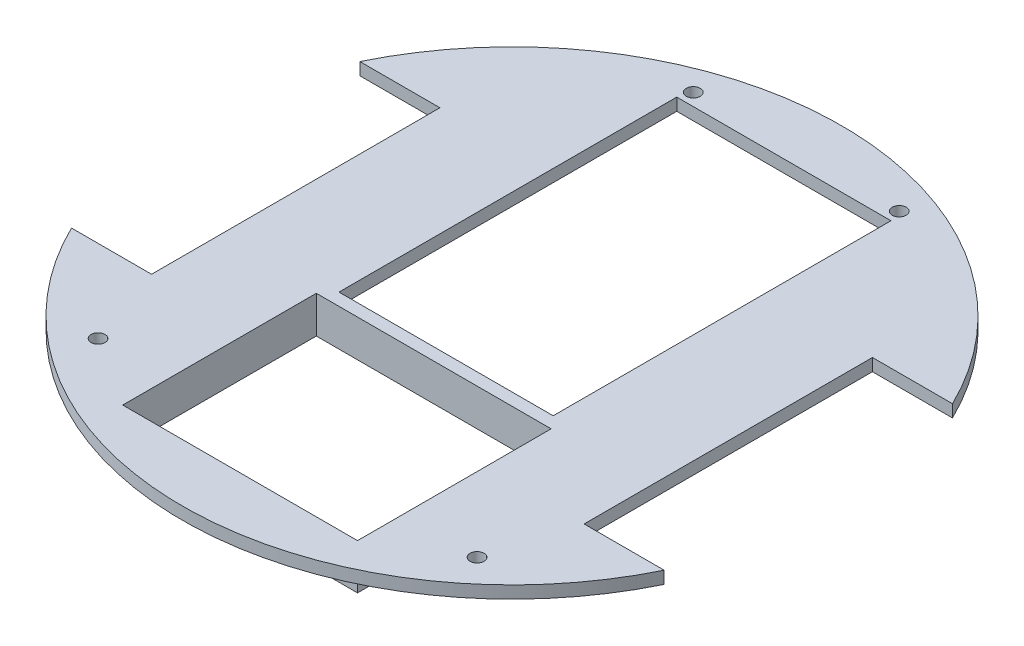
ISO-10303-21;
HEADER;
FILE_DESCRIPTION(('STEP AP214'),'2;1');
FILE_NAME('part.step','',(''),(''),'','','');
FILE_SCHEMA(('AUTOMOTIVE_DESIGN { 1 0 10303 214 1 1 1 1 }'));
ENDSEC;
DATA;
#1=APPLICATION_CONTEXT('core data for automotive mechanical design processes');
#2=APPLICATION_PROTOCOL_DEFINITION('international standard','automotive_design',2000,#1);
#3=PRODUCT_CONTEXT('',#1,'mechanical');
#4=PRODUCT('Part','Part','',(#3));
#5=PRODUCT_RELATED_PRODUCT_CATEGORY('part','',(#4));
#6=PRODUCT_DEFINITION_FORMATION('','',#4);
#7=PRODUCT_DEFINITION_CONTEXT('part definition',#1,'design');
#8=PRODUCT_DEFINITION('design','',#6,#7);
#9=PRODUCT_DEFINITION_SHAPE('','',#8);
#10=(LENGTH_UNIT() NAMED_UNIT(*) SI_UNIT(.MILLI.,.METRE.));
#11=(NAMED_UNIT(*) PLANE_ANGLE_UNIT() SI_UNIT($,.RADIAN.));
#12=(NAMED_UNIT(*) SI_UNIT($,.STERADIAN.) SOLID_ANGLE_UNIT());
#13=UNCERTAINTY_MEASURE_WITH_UNIT(LENGTH_MEASURE(1.E-05),#10,'distance_accuracy_value','');
#14=(GEOMETRIC_REPRESENTATION_CONTEXT(3) GLOBAL_UNCERTAINTY_ASSIGNED_CONTEXT((#13)) GLOBAL_UNIT_ASSIGNED_CONTEXT((#10,
#11,#12)) REPRESENTATION_CONTEXT('',''));
#15=CARTESIAN_POINT('',(0.,0.,0.));
#16=DIRECTION('',(0.,0.,1.));
#17=DIRECTION('',(1.,0.,0.));
#18=AXIS2_PLACEMENT_3D('',#15,#16,#17);
#19=CARTESIAN_POINT('',(0.,0.,0.));
#20=DIRECTION('',(0.,1.,0.));
#21=DIRECTION('',(0.,0.,1.));
#22=AXIS2_PLACEMENT_3D('',#19,#20,#21);
#23=PLANE('',#22);
#24=DIRECTION('',(0.,0.,1.));
#25=VECTOR('',#24,1.);
#26=CARTESIAN_POINT('',(52.5,0.,35.));
#27=LINE('',#26,#25);
#28=CARTESIAN_POINT('',(52.5,0.,-35.));
#29=VERTEX_POINT('',#28);
#30=CARTESIAN_POINT('',(52.5,0.,35.));
#31=VERTEX_POINT('',#30);
#32=EDGE_CURVE('E292',#29,#31,#27,.T.);
#33=ORIENTED_EDGE('',*,*,#32,.T.);
#34=DIRECTION('',(1.,0.,0.));
#35=VECTOR('',#34,1.);
#36=CARTESIAN_POINT('',(107.5,0.,35.));
#37=LINE('',#36,#35);
#38=CARTESIAN_POINT('',(71.9374728496908,0.,35.));
#39=VERTEX_POINT('',#38);
#40=EDGE_CURVE('E295',#31,#39,#37,.T.);
#41=ORIENTED_EDGE('',*,*,#40,.T.);
#42=CARTESIAN_POINT('',(0.,0.,0.));
#43=DIRECTION('',(0.,1.,0.));
#44=DIRECTION('',(0.,0.,1.));
#45=AXIS2_PLACEMENT_3D('',#42,#43,#44);
#46=CIRCLE('',#45,80.);
#47=CARTESIAN_POINT('',(-71.9374728496908,0.,35.));
#48=VERTEX_POINT('',#47);
#49=EDGE_CURVE('E345',#48,#39,#46,.T.);
#50=ORIENTED_EDGE('',*,*,#49,.F.);
#51=DIRECTION('',(1.,0.,0.));
#52=VECTOR('',#51,1.);
#53=CARTESIAN_POINT('',(0.,0.,35.));
#54=LINE('',#53,#52);
#55=CARTESIAN_POINT('',(-52.5,0.,35.));
#56=VERTEX_POINT('',#55);
#57=EDGE_CURVE('E42',#48,#56,#54,.T.);
#58=ORIENTED_EDGE('',*,*,#57,.T.);
#59=DIRECTION('',(0.,0.,-1.));
#60=VECTOR('',#59,1.);
#61=CARTESIAN_POINT('',(-52.5,0.,35.));
#62=LINE('',#61,#60);
#63=CARTESIAN_POINT('',(-52.5,0.,-35.));
#64=VERTEX_POINT('',#63);
#65=EDGE_CURVE('E316',#56,#64,#62,.T.);
#66=ORIENTED_EDGE('',*,*,#65,.T.);
#67=DIRECTION('',(-1.,0.,0.));
#68=VECTOR('',#67,1.);
#69=CARTESIAN_POINT('',(-107.5,0.,-35.));
#70=LINE('',#69,#68);
#71=CARTESIAN_POINT('',(-71.9374728496908,0.,-35.));
#72=VERTEX_POINT('',#71);
#73=EDGE_CURVE('E319',#64,#72,#70,.T.);
#74=ORIENTED_EDGE('',*,*,#73,.T.);
#75=CARTESIAN_POINT('',(71.9374728496908,0.,-35.));
#76=VERTEX_POINT('',#75);
#77=EDGE_CURVE('E340',#76,#72,#46,.T.);
#78=ORIENTED_EDGE('',*,*,#77,.F.);
#79=DIRECTION('',(-1.,0.,0.));
#80=VECTOR('',#79,1.);
#81=CARTESIAN_POINT('',(0.,0.,-35.));
#82=LINE('',#81,#80);
#83=EDGE_CURVE('E11',#76,#29,#82,.T.);
#84=ORIENTED_EDGE('',*,*,#83,.T.);
#85=EDGE_LOOP('',(#33,#41,#50,#58,#66,#74,#78,#84));
#86=FACE_BOUND('',#85,.T.);
#87=CARTESIAN_POINT('',(25.,0.,-69.));
#88=DIRECTION('',(0.,1.,0.));
#89=DIRECTION('',(0.,0.,1.));
#90=AXIS2_PLACEMENT_3D('',#87,#88,#89);
#91=CIRCLE('',#90,1.69999999999999);
#92=CARTESIAN_POINT('',(25.,0.,-67.3));
#93=VERTEX_POINT('',#92);
#94=EDGE_CURVE('E288',#93,#93,#91,.T.);
#95=ORIENTED_EDGE('',*,*,#94,.T.);
#96=EDGE_LOOP('',(#95));
#97=FACE_BOUND('',#96,.T.);
#98=CARTESIAN_POINT('',(-25.,0.,-69.));
#99=DIRECTION('',(0.,1.,0.));
#100=DIRECTION('',(0.,0.,1.));
#101=AXIS2_PLACEMENT_3D('',#98,#99,#100);
#102=CIRCLE('',#101,1.69999999999999);
#103=CARTESIAN_POINT('',(-25.,0.,-67.3));
#104=VERTEX_POINT('',#103);
#105=EDGE_CURVE('E284',#104,#104,#102,.T.);
#106=ORIENTED_EDGE('',*,*,#105,.T.);
#107=EDGE_LOOP('',(#106));
#108=FACE_BOUND('',#107,.T.);
#109=CARTESIAN_POINT('',(46.5164277915735,0.,55.));
#110=DIRECTION('',(0.,1.,0.));
#111=DIRECTION('',(0.,0.,1.));
#112=AXIS2_PLACEMENT_3D('',#109,#110,#111);
#113=CIRCLE('',#112,1.69999999999999);
#114=CARTESIAN_POINT('',(46.5164277915735,0.,56.7));
#115=VERTEX_POINT('',#114);
#116=EDGE_CURVE('E278',#115,#115,#113,.T.);
#117=ORIENTED_EDGE('',*,*,#116,.T.);
#118=EDGE_LOOP('',(#117));
#119=FACE_BOUND('',#118,.T.);
#120=CARTESIAN_POINT('',(-45.4835722084265,0.,55.));
#121=DIRECTION('',(0.,1.,0.));
#122=DIRECTION('',(0.,0.,1.));
#123=AXIS2_PLACEMENT_3D('',#120,#121,#122);
#124=CIRCLE('',#123,1.69999999999999);
#125=CARTESIAN_POINT('',(-45.4835722084265,0.,56.7));
#126=VERTEX_POINT('',#125);
#127=EDGE_CURVE('E37',#126,#126,#124,.T.);
#128=ORIENTED_EDGE('',*,*,#127,.T.);
#129=EDGE_LOOP('',(#128));
#130=FACE_BOUND('',#129,.T.);
#131=DIRECTION('',(-1.,0.,0.));
#132=VECTOR('',#131,1.);
#133=CARTESIAN_POINT('',(-26.,0.,-66.));
#134=LINE('',#133,#132);
#135=CARTESIAN_POINT('',(26.,0.,-66.));
#136=VERTEX_POINT('',#135);
#137=CARTESIAN_POINT('',(-26.,0.,-66.));
#138=VERTEX_POINT('',#137);
#139=EDGE_CURVE('E251',#136,#138,#134,.T.);
#140=ORIENTED_EDGE('',*,*,#139,.T.);
#141=DIRECTION('',(0.,0.,1.));
#142=VECTOR('',#141,1.);
#143=CARTESIAN_POINT('',(-26.,0.,-66.));
#144=LINE('',#143,#142);
#145=CARTESIAN_POINT('',(-26.,0.,16.));
#146=VERTEX_POINT('',#145);
#147=EDGE_CURVE('E241',#138,#146,#144,.T.);
#148=ORIENTED_EDGE('',*,*,#147,.T.);
#149=DIRECTION('',(1.,0.,0.));
#150=VECTOR('',#149,1.);
#151=CARTESIAN_POINT('',(-26.,0.,16.));
#152=LINE('',#151,#150);
#153=CARTESIAN_POINT('',(26.,0.,16.));
#154=VERTEX_POINT('',#153);
#155=EDGE_CURVE('E244',#146,#154,#152,.T.);
#156=ORIENTED_EDGE('',*,*,#155,.T.);
#157=DIRECTION('',(0.,0.,-1.));
#158=VECTOR('',#157,1.);
#159=CARTESIAN_POINT('',(26.,0.,-66.));
#160=LINE('',#159,#158);
#161=EDGE_CURVE('E248',#154,#136,#160,.T.);
#162=ORIENTED_EDGE('',*,*,#161,.T.);
#163=EDGE_LOOP('',(#140,#148,#156,#162));
#164=FACE_BOUND('',#163,.T.);
#165=DIRECTION('',(0.,0.,-1.));
#166=VECTOR('',#165,1.);
#167=CARTESIAN_POINT('',(-30.5,0.,68.));
#168=LINE('',#167,#166);
#169=CARTESIAN_POINT('',(-30.5,0.,68.));
#170=VERTEX_POINT('',#169);
#171=CARTESIAN_POINT('',(-30.5,0.,17.));
#172=VERTEX_POINT('',#171);
#173=EDGE_CURVE('E200',#170,#172,#168,.T.);
#174=ORIENTED_EDGE('',*,*,#173,.F.);
#175=DIRECTION('',(-1.,0.,0.));
#176=VECTOR('',#175,1.);
#177=CARTESIAN_POINT('',(-30.5,0.,68.));
#178=LINE('',#177,#176);
#179=CARTESIAN_POINT('',(30.5,0.,68.));
#180=VERTEX_POINT('',#179);
#181=EDGE_CURVE('E205',#180,#170,#178,.T.);
#182=ORIENTED_EDGE('',*,*,#181,.F.);
#183=DIRECTION('',(0.,0.,1.));
#184=VECTOR('',#183,1.);
#185=CARTESIAN_POINT('',(30.5,0.,68.));
#186=LINE('',#185,#184);
#187=CARTESIAN_POINT('',(30.5,0.,17.));
#188=VERTEX_POINT('',#187);
#189=EDGE_CURVE('E55',#188,#180,#186,.T.);
#190=ORIENTED_EDGE('',*,*,#189,.F.);
#191=DIRECTION('',(1.,0.,0.));
#192=VECTOR('',#191,1.);
#193=CARTESIAN_POINT('',(-30.5,0.,17.));
#194=LINE('',#193,#192);
#195=EDGE_CURVE('E50',#172,#188,#194,.T.);
#196=ORIENTED_EDGE('',*,*,#195,.F.);
#197=EDGE_LOOP('',(#174,#182,#190,#196));
#198=FACE_BOUND('',#197,.T.);
#199=ADVANCED_FACE('F33',(#86,#97,#108,#119,#130,#164,#198),#23,.F.);
#200=CARTESIAN_POINT('',(0.,3.,0.));
#201=DIRECTION('',(0.,-1.,0.));
#202=DIRECTION('',(0.,0.,-1.));
#203=AXIS2_PLACEMENT_3D('',#200,#201,#202);
#204=CYLINDRICAL_SURFACE('',#203,80.);
#205=ORIENTED_EDGE('',*,*,#49,.T.);
#206=DIRECTION('',(0.,-1.,0.));
#207=VECTOR('',#206,1.);
#208=CARTESIAN_POINT('',(71.9374728496908,3.,35.));
#209=LINE('',#208,#207);
#210=CARTESIAN_POINT('',(71.9374728496908,3.,35.));
#211=VERTEX_POINT('',#210);
#212=EDGE_CURVE('E312',#39,#211,#209,.F.);
#213=ORIENTED_EDGE('',*,*,#212,.T.);
#214=CARTESIAN_POINT('',(0.,3.,0.));
#215=DIRECTION('',(0.,1.,0.));
#216=DIRECTION('',(0.,0.,1.));
#217=AXIS2_PLACEMENT_3D('',#214,#215,#216);
#218=CIRCLE('',#217,80.);
#219=CARTESIAN_POINT('',(-71.9374728496908,3.,35.));
#220=VERTEX_POINT('',#219);
#221=EDGE_CURVE('E341',#220,#211,#218,.T.);
#222=ORIENTED_EDGE('',*,*,#221,.F.);
#223=DIRECTION('',(0.,-1.,0.));
#224=VECTOR('',#223,1.);
#225=CARTESIAN_POINT('',(-71.9374728496908,3.,35.));
#226=LINE('',#225,#224);
#227=EDGE_CURVE('E337',#220,#48,#226,.T.);
#228=ORIENTED_EDGE('',*,*,#227,.T.);
#229=EDGE_LOOP('',(#205,#213,#222,#228));
#230=FACE_BOUND('',#229,.T.);
#231=ADVANCED_FACE('F371',(#230),#204,.T.);
#232=CARTESIAN_POINT('',(71.9374728496908,3.,-35.));
#233=VERTEX_POINT('',#232);
#234=CARTESIAN_POINT('',(-71.9374728496908,3.,-35.));
#235=VERTEX_POINT('',#234);
#236=EDGE_CURVE('E344',#233,#235,#218,.T.);
#237=ORIENTED_EDGE('',*,*,#236,.F.);
#238=DIRECTION('',(0.,-1.,0.));
#239=VECTOR('',#238,1.);
#240=CARTESIAN_POINT('',(71.9374728496908,3.,-35.));
#241=LINE('',#240,#239);
#242=EDGE_CURVE('E307',#233,#76,#241,.T.);
#243=ORIENTED_EDGE('',*,*,#242,.T.);
#244=ORIENTED_EDGE('',*,*,#77,.T.);
#245=DIRECTION('',(0.,-1.,0.));
#246=VECTOR('',#245,1.);
#247=CARTESIAN_POINT('',(-71.9374728496908,3.,-35.));
#248=LINE('',#247,#246);
#249=EDGE_CURVE('E333',#72,#235,#248,.F.);
#250=ORIENTED_EDGE('',*,*,#249,.T.);
#251=EDGE_LOOP('',(#237,#243,#244,#250));
#252=FACE_BOUND('',#251,.T.);
#253=ADVANCED_FACE('F35',(#252),#204,.T.);
#254=CARTESIAN_POINT('',(0.,3.,0.));
#255=DIRECTION('',(0.,1.,0.));
#256=DIRECTION('',(0.,0.,1.));
#257=AXIS2_PLACEMENT_3D('',#254,#255,#256);
#258=PLANE('',#257);
#259=DIRECTION('',(0.,0.,1.));
#260=VECTOR('',#259,1.);
#261=CARTESIAN_POINT('',(-28.5,3.,19.));
#262=LINE('',#261,#260);
#263=CARTESIAN_POINT('',(-28.5,3.,19.));
#264=VERTEX_POINT('',#263);
#265=CARTESIAN_POINT('',(-28.5,3.,66.));
#266=VERTEX_POINT('',#265);
#267=EDGE_CURVE('E228',#264,#266,#262,.T.);
#268=ORIENTED_EDGE('',*,*,#267,.F.);
#269=DIRECTION('',(-1.,0.,0.));
#270=VECTOR('',#269,1.);
#271=CARTESIAN_POINT('',(-28.5,3.,19.));
#272=LINE('',#271,#270);
#273=CARTESIAN_POINT('',(28.5,3.,19.));
#274=VERTEX_POINT('',#273);
#275=EDGE_CURVE('E177',#274,#264,#272,.T.);
#276=ORIENTED_EDGE('',*,*,#275,.F.);
#277=DIRECTION('',(0.,0.,-1.));
#278=VECTOR('',#277,1.);
#279=CARTESIAN_POINT('',(28.5,3.,19.));
#280=LINE('',#279,#278);
#281=CARTESIAN_POINT('',(28.5,3.,66.));
#282=VERTEX_POINT('',#281);
#283=EDGE_CURVE('E233',#282,#274,#280,.T.);
#284=ORIENTED_EDGE('',*,*,#283,.F.);
#285=DIRECTION('',(1.,0.,0.));
#286=VECTOR('',#285,1.);
#287=CARTESIAN_POINT('',(-28.5,3.,66.));
#288=LINE('',#287,#286);
#289=EDGE_CURVE('E230',#266,#282,#288,.T.);
#290=ORIENTED_EDGE('',*,*,#289,.F.);
#291=EDGE_LOOP('',(#268,#276,#284,#290));
#292=FACE_BOUND('',#291,.T.);
#293=DIRECTION('',(0.,0.,1.));
#294=VECTOR('',#293,1.);
#295=CARTESIAN_POINT('',(-26.,3.,-66.));
#296=LINE('',#295,#294);
#297=CARTESIAN_POINT('',(-26.,3.,-66.));
#298=VERTEX_POINT('',#297);
#299=CARTESIAN_POINT('',(-26.,3.,16.));
#300=VERTEX_POINT('',#299);
#301=EDGE_CURVE('E180',#298,#300,#296,.T.);
#302=ORIENTED_EDGE('',*,*,#301,.F.);
#303=DIRECTION('',(-1.,0.,0.));
#304=VECTOR('',#303,1.);
#305=CARTESIAN_POINT('',(-26.,3.,-66.));
#306=LINE('',#305,#304);
#307=CARTESIAN_POINT('',(26.,3.,-66.));
#308=VERTEX_POINT('',#307);
#309=EDGE_CURVE('E245',#308,#298,#306,.T.);
#310=ORIENTED_EDGE('',*,*,#309,.F.);
#311=DIRECTION('',(0.,0.,-1.));
#312=VECTOR('',#311,1.);
#313=CARTESIAN_POINT('',(26.,3.,-66.));
#314=LINE('',#313,#312);
#315=CARTESIAN_POINT('',(26.,3.,16.));
#316=VERTEX_POINT('',#315);
#317=EDGE_CURVE('E259',#316,#308,#314,.T.);
#318=ORIENTED_EDGE('',*,*,#317,.F.);
#319=DIRECTION('',(1.,0.,0.));
#320=VECTOR('',#319,1.);
#321=CARTESIAN_POINT('',(-26.,3.,16.));
#322=LINE('',#321,#320);
#323=EDGE_CURVE('E256',#300,#316,#322,.T.);
#324=ORIENTED_EDGE('',*,*,#323,.F.);
#325=EDGE_LOOP('',(#302,#310,#318,#324));
#326=FACE_BOUND('',#325,.T.);
#327=CARTESIAN_POINT('',(-45.4835722084265,3.,55.));
#328=DIRECTION('',(0.,1.,0.));
#329=DIRECTION('',(0.,0.,1.));
#330=AXIS2_PLACEMENT_3D('',#327,#328,#329);
#331=CIRCLE('',#330,1.69999999999999);
#332=CARTESIAN_POINT('',(-45.4835722084265,3.,56.7));
#333=VERTEX_POINT('',#332);
#334=EDGE_CURVE('E266',#333,#333,#331,.T.);
#335=ORIENTED_EDGE('',*,*,#334,.F.);
#336=EDGE_LOOP('',(#335));
#337=FACE_BOUND('',#336,.T.);
#338=CARTESIAN_POINT('',(46.5164277915735,3.,55.));
#339=DIRECTION('',(0.,1.,0.));
#340=DIRECTION('',(0.,0.,1.));
#341=AXIS2_PLACEMENT_3D('',#338,#339,#340);
#342=CIRCLE('',#341,1.69999999999999);
#343=CARTESIAN_POINT('',(46.5164277915735,3.,56.7));
#344=VERTEX_POINT('',#343);
#345=EDGE_CURVE('E275',#344,#344,#342,.T.);
#346=ORIENTED_EDGE('',*,*,#345,.F.);
#347=EDGE_LOOP('',(#346));
#348=FACE_BOUND('',#347,.T.);
#349=CARTESIAN_POINT('',(-25.,3.,-69.));
#350=DIRECTION('',(0.,1.,0.));
#351=DIRECTION('',(0.,0.,1.));
#352=AXIS2_PLACEMENT_3D('',#349,#350,#351);
#353=CIRCLE('',#352,1.7);
#354=CARTESIAN_POINT('',(-25.,3.,-67.3));
#355=VERTEX_POINT('',#354);
#356=EDGE_CURVE('E281',#355,#355,#353,.T.);
#357=ORIENTED_EDGE('',*,*,#356,.F.);
#358=EDGE_LOOP('',(#357));
#359=FACE_BOUND('',#358,.T.);
#360=CARTESIAN_POINT('',(25.,3.,-69.));
#361=DIRECTION('',(0.,1.,0.));
#362=DIRECTION('',(0.,0.,1.));
#363=AXIS2_PLACEMENT_3D('',#360,#361,#362);
#364=CIRCLE('',#363,1.7);
#365=CARTESIAN_POINT('',(25.,3.,-67.3));
#366=VERTEX_POINT('',#365);
#367=EDGE_CURVE('E285',#366,#366,#364,.T.);
#368=ORIENTED_EDGE('',*,*,#367,.F.);
#369=EDGE_LOOP('',(#368));
#370=FACE_BOUND('',#369,.T.);
#371=DIRECTION('',(1.,0.,0.));
#372=VECTOR('',#371,1.);
#373=CARTESIAN_POINT('',(107.5,3.,35.));
#374=LINE('',#373,#372);
#375=CARTESIAN_POINT('',(52.5,3.,35.));
#376=VERTEX_POINT('',#375);
#377=EDGE_CURVE('E296',#376,#211,#374,.T.);
#378=ORIENTED_EDGE('',*,*,#377,.F.);
#379=DIRECTION('',(0.,0.,1.));
#380=VECTOR('',#379,1.);
#381=CARTESIAN_POINT('',(52.5,3.,35.));
#382=LINE('',#381,#380);
#383=CARTESIAN_POINT('',(52.5,3.,-35.));
#384=VERTEX_POINT('',#383);
#385=EDGE_CURVE('E301',#384,#376,#382,.T.);
#386=ORIENTED_EDGE('',*,*,#385,.F.);
#387=DIRECTION('',(-1.,0.,0.));
#388=VECTOR('',#387,1.);
#389=CARTESIAN_POINT('',(107.5,3.,-35.));
#390=LINE('',#389,#388);
#391=EDGE_CURVE('E291',#233,#384,#390,.T.);
#392=ORIENTED_EDGE('',*,*,#391,.F.);
#393=ORIENTED_EDGE('',*,*,#236,.T.);
#394=DIRECTION('',(-1.,0.,0.));
#395=VECTOR('',#394,1.);
#396=CARTESIAN_POINT('',(-107.5,3.,-35.));
#397=LINE('',#396,#395);
#398=CARTESIAN_POINT('',(-52.5,3.,-35.));
#399=VERTEX_POINT('',#398);
#400=EDGE_CURVE('E326',#399,#235,#397,.T.);
#401=ORIENTED_EDGE('',*,*,#400,.F.);
#402=DIRECTION('',(0.,0.,-1.));
#403=VECTOR('',#402,1.);
#404=CARTESIAN_POINT('',(-52.5,3.,35.));
#405=LINE('',#404,#403);
#406=CARTESIAN_POINT('',(-52.5,3.,35.));
#407=VERTEX_POINT('',#406);
#408=EDGE_CURVE('E315',#407,#399,#405,.T.);
#409=ORIENTED_EDGE('',*,*,#408,.F.);
#410=DIRECTION('',(1.,0.,0.));
#411=VECTOR('',#410,1.);
#412=CARTESIAN_POINT('',(-107.5,3.,35.));
#413=LINE('',#412,#411);
#414=EDGE_CURVE('E320',#220,#407,#413,.T.);
#415=ORIENTED_EDGE('',*,*,#414,.F.);
#416=ORIENTED_EDGE('',*,*,#221,.T.);
#417=EDGE_LOOP('',(#378,#386,#392,#393,#401,#409,#415,#416));
#418=FACE_BOUND('',#417,.T.);
#419=ADVANCED_FACE('F381',(#292,#326,#337,#348,#359,#370,#418),#258,.T.);
#420=CARTESIAN_POINT('',(-107.5,0.,35.));
#421=DIRECTION('',(0.,0.,1.));
#422=DIRECTION('',(1.,0.,0.));
#423=AXIS2_PLACEMENT_3D('',#420,#421,#422);
#424=PLANE('',#423);
#425=ORIENTED_EDGE('',*,*,#414,.T.);
#426=DIRECTION('',(0.,1.,0.));
#427=VECTOR('',#426,1.);
#428=CARTESIAN_POINT('',(-52.5,0.,35.));
#429=LINE('',#428,#427);
#430=EDGE_CURVE('E330',#56,#407,#429,.T.);
#431=ORIENTED_EDGE('',*,*,#430,.F.);
#432=ORIENTED_EDGE('',*,*,#57,.F.);
#433=ORIENTED_EDGE('',*,*,#227,.F.);
#434=EDGE_LOOP('',(#425,#431,#432,#433));
#435=FACE_BOUND('',#434,.T.);
#436=ADVANCED_FACE('F384',(#435),#424,.F.);
#437=CARTESIAN_POINT('',(-107.5,0.,-35.));
#438=DIRECTION('',(0.,0.,-1.));
#439=DIRECTION('',(-1.,0.,0.));
#440=AXIS2_PLACEMENT_3D('',#437,#438,#439);
#441=PLANE('',#440);
#442=ORIENTED_EDGE('',*,*,#73,.F.);
#443=DIRECTION('',(0.,1.,0.));
#444=VECTOR('',#443,1.);
#445=CARTESIAN_POINT('',(-52.5,0.,-35.));
#446=LINE('',#445,#444);
#447=EDGE_CURVE('E323',#64,#399,#446,.T.);
#448=ORIENTED_EDGE('',*,*,#447,.T.);
#449=ORIENTED_EDGE('',*,*,#400,.T.);
#450=ORIENTED_EDGE('',*,*,#249,.F.);
#451=EDGE_LOOP('',(#442,#448,#449,#450));
#452=FACE_BOUND('',#451,.T.);
#453=ADVANCED_FACE('F390',(#452),#441,.F.);
#454=CARTESIAN_POINT('',(-52.5,0.,35.));
#455=DIRECTION('',(1.,0.,0.));
#456=DIRECTION('',(0.,0.,-1.));
#457=AXIS2_PLACEMENT_3D('',#454,#455,#456);
#458=PLANE('',#457);
#459=ORIENTED_EDGE('',*,*,#408,.T.);
#460=ORIENTED_EDGE('',*,*,#447,.F.);
#461=ORIENTED_EDGE('',*,*,#65,.F.);
#462=ORIENTED_EDGE('',*,*,#430,.T.);
#463=EDGE_LOOP('',(#459,#460,#461,#462));
#464=FACE_BOUND('',#463,.T.);
#465=ADVANCED_FACE('F386',(#464),#458,.F.);
#466=CARTESIAN_POINT('',(107.5,0.,35.));
#467=DIRECTION('',(0.,0.,1.));
#468=DIRECTION('',(1.,0.,0.));
#469=AXIS2_PLACEMENT_3D('',#466,#467,#468);
#470=PLANE('',#469);
#471=ORIENTED_EDGE('',*,*,#40,.F.);
#472=DIRECTION('',(0.,1.,0.));
#473=VECTOR('',#472,1.);
#474=CARTESIAN_POINT('',(52.5,0.,35.));
#475=LINE('',#474,#473);
#476=EDGE_CURVE('E305',#31,#376,#475,.T.);
#477=ORIENTED_EDGE('',*,*,#476,.T.);
#478=ORIENTED_EDGE('',*,*,#377,.T.);
#479=ORIENTED_EDGE('',*,*,#212,.F.);
#480=EDGE_LOOP('',(#471,#477,#478,#479));
#481=FACE_BOUND('',#480,.T.);
#482=ADVANCED_FACE('F389',(#481),#470,.F.);
#483=CARTESIAN_POINT('',(107.5,0.,-35.));
#484=DIRECTION('',(0.,0.,-1.));
#485=DIRECTION('',(-1.,0.,0.));
#486=AXIS2_PLACEMENT_3D('',#483,#484,#485);
#487=PLANE('',#486);
#488=ORIENTED_EDGE('',*,*,#391,.T.);
#489=DIRECTION('',(0.,1.,0.));
#490=VECTOR('',#489,1.);
#491=CARTESIAN_POINT('',(52.5,0.,-35.));
#492=LINE('',#491,#490);
#493=EDGE_CURVE('E299',#29,#384,#492,.T.);
#494=ORIENTED_EDGE('',*,*,#493,.F.);
#495=ORIENTED_EDGE('',*,*,#83,.F.);
#496=ORIENTED_EDGE('',*,*,#242,.F.);
#497=EDGE_LOOP('',(#488,#494,#495,#496));
#498=FACE_BOUND('',#497,.T.);
#499=ADVANCED_FACE('F398',(#498),#487,.F.);
#500=CARTESIAN_POINT('',(52.5,0.,35.));
#501=DIRECTION('',(-1.,0.,0.));
#502=DIRECTION('',(0.,0.,1.));
#503=AXIS2_PLACEMENT_3D('',#500,#501,#502);
#504=PLANE('',#503);
#505=ORIENTED_EDGE('',*,*,#385,.T.);
#506=ORIENTED_EDGE('',*,*,#476,.F.);
#507=ORIENTED_EDGE('',*,*,#32,.F.);
#508=ORIENTED_EDGE('',*,*,#493,.T.);
#509=EDGE_LOOP('',(#505,#506,#507,#508));
#510=FACE_BOUND('',#509,.T.);
#511=ADVANCED_FACE('F367',(#510),#504,.F.);
#512=CARTESIAN_POINT('',(25.,3.,-69.));
#513=DIRECTION('',(0.,1.,0.));
#514=DIRECTION('',(0.,0.,1.));
#515=AXIS2_PLACEMENT_3D('',#512,#513,#514);
#516=CYLINDRICAL_SURFACE('',#515,1.69999999999999);
#517=ORIENTED_EDGE('',*,*,#367,.T.);
#518=EDGE_LOOP('',(#517));
#519=FACE_BOUND('',#518,.T.);
#520=ORIENTED_EDGE('',*,*,#94,.F.);
#521=EDGE_LOOP('',(#520));
#522=FACE_BOUND('',#521,.T.);
#523=ADVANCED_FACE('F357',(#519,#522),#516,.F.);
#524=CARTESIAN_POINT('',(-25.,3.,-69.));
#525=DIRECTION('',(0.,1.,0.));
#526=DIRECTION('',(0.,0.,1.));
#527=AXIS2_PLACEMENT_3D('',#524,#525,#526);
#528=CYLINDRICAL_SURFACE('',#527,1.69999999999999);
#529=ORIENTED_EDGE('',*,*,#356,.T.);
#530=EDGE_LOOP('',(#529));
#531=FACE_BOUND('',#530,.T.);
#532=ORIENTED_EDGE('',*,*,#105,.F.);
#533=EDGE_LOOP('',(#532));
#534=FACE_BOUND('',#533,.T.);
#535=ADVANCED_FACE('F354',(#531,#534),#528,.F.);
#536=CARTESIAN_POINT('',(46.5164277915735,3.,55.));
#537=DIRECTION('',(0.,1.,0.));
#538=DIRECTION('',(0.,0.,1.));
#539=AXIS2_PLACEMENT_3D('',#536,#537,#538);
#540=CYLINDRICAL_SURFACE('',#539,1.69999999999999);
#541=ORIENTED_EDGE('',*,*,#345,.T.);
#542=EDGE_LOOP('',(#541));
#543=FACE_BOUND('',#542,.T.);
#544=ORIENTED_EDGE('',*,*,#116,.F.);
#545=EDGE_LOOP('',(#544));
#546=FACE_BOUND('',#545,.T.);
#547=ADVANCED_FACE('F356',(#543,#546),#540,.F.);
#548=CARTESIAN_POINT('',(-45.4835722084265,3.,55.));
#549=DIRECTION('',(0.,1.,0.));
#550=DIRECTION('',(0.,0.,1.));
#551=AXIS2_PLACEMENT_3D('',#548,#549,#550);
#552=CYLINDRICAL_SURFACE('',#551,1.69999999999999);
#553=ORIENTED_EDGE('',*,*,#334,.T.);
#554=EDGE_LOOP('',(#553));
#555=FACE_BOUND('',#554,.T.);
#556=ORIENTED_EDGE('',*,*,#127,.F.);
#557=EDGE_LOOP('',(#556));
#558=FACE_BOUND('',#557,.T.);
#559=ADVANCED_FACE('F364',(#555,#558),#552,.F.);
#560=CARTESIAN_POINT('',(-26.,0.,-66.));
#561=DIRECTION('',(-1.,0.,0.));
#562=DIRECTION('',(0.,0.,1.));
#563=AXIS2_PLACEMENT_3D('',#560,#561,#562);
#564=PLANE('',#563);
#565=ORIENTED_EDGE('',*,*,#301,.T.);
#566=DIRECTION('',(0.,1.,0.));
#567=VECTOR('',#566,1.);
#568=CARTESIAN_POINT('',(-26.,0.,16.));
#569=LINE('',#568,#567);
#570=EDGE_CURVE('E254',#146,#300,#569,.T.);
#571=ORIENTED_EDGE('',*,*,#570,.F.);
#572=ORIENTED_EDGE('',*,*,#147,.F.);
#573=DIRECTION('',(0.,1.,0.));
#574=VECTOR('',#573,1.);
#575=CARTESIAN_POINT('',(-26.,0.,-66.));
#576=LINE('',#575,#574);
#577=EDGE_CURVE('E264',#138,#298,#576,.T.);
#578=ORIENTED_EDGE('',*,*,#577,.T.);
#579=EDGE_LOOP('',(#565,#571,#572,#578));
#580=FACE_BOUND('',#579,.T.);
#581=ADVANCED_FACE('F488',(#580),#564,.F.);
#582=CARTESIAN_POINT('',(-26.,0.,-66.));
#583=DIRECTION('',(0.,0.,-1.));
#584=DIRECTION('',(-1.,0.,0.));
#585=AXIS2_PLACEMENT_3D('',#582,#583,#584);
#586=PLANE('',#585);
#587=ORIENTED_EDGE('',*,*,#309,.T.);
#588=ORIENTED_EDGE('',*,*,#577,.F.);
#589=ORIENTED_EDGE('',*,*,#139,.F.);
#590=DIRECTION('',(0.,1.,0.));
#591=VECTOR('',#590,1.);
#592=CARTESIAN_POINT('',(26.,0.,-66.));
#593=LINE('',#592,#591);
#594=EDGE_CURVE('E267',#136,#308,#593,.T.);
#595=ORIENTED_EDGE('',*,*,#594,.T.);
#596=EDGE_LOOP('',(#587,#588,#589,#595));
#597=FACE_BOUND('',#596,.T.);
#598=ADVANCED_FACE('F498',(#597),#586,.F.);
#599=CARTESIAN_POINT('',(26.,0.,-66.));
#600=DIRECTION('',(1.,0.,0.));
#601=DIRECTION('',(0.,0.,-1.));
#602=AXIS2_PLACEMENT_3D('',#599,#600,#601);
#603=PLANE('',#602);
#604=ORIENTED_EDGE('',*,*,#317,.T.);
#605=ORIENTED_EDGE('',*,*,#594,.F.);
#606=ORIENTED_EDGE('',*,*,#161,.F.);
#607=DIRECTION('',(0.,1.,0.));
#608=VECTOR('',#607,1.);
#609=CARTESIAN_POINT('',(26.,0.,16.));
#610=LINE('',#609,#608);
#611=EDGE_CURVE('E269',#154,#316,#610,.T.);
#612=ORIENTED_EDGE('',*,*,#611,.T.);
#613=EDGE_LOOP('',(#604,#605,#606,#612));
#614=FACE_BOUND('',#613,.T.);
#615=ADVANCED_FACE('F505',(#614),#603,.F.);
#616=CARTESIAN_POINT('',(-26.,0.,16.));
#617=DIRECTION('',(0.,0.,1.));
#618=DIRECTION('',(1.,0.,0.));
#619=AXIS2_PLACEMENT_3D('',#616,#617,#618);
#620=PLANE('',#619);
#621=ORIENTED_EDGE('',*,*,#323,.T.);
#622=ORIENTED_EDGE('',*,*,#611,.F.);
#623=ORIENTED_EDGE('',*,*,#155,.F.);
#624=ORIENTED_EDGE('',*,*,#570,.T.);
#625=EDGE_LOOP('',(#621,#622,#623,#624));
#626=FACE_BOUND('',#625,.T.);
#627=ADVANCED_FACE('F513',(#626),#620,.F.);
#628=CARTESIAN_POINT('',(-28.5,0.,19.));
#629=DIRECTION('',(-1.,0.,0.));
#630=DIRECTION('',(0.,0.,1.));
#631=AXIS2_PLACEMENT_3D('',#628,#629,#630);
#632=PLANE('',#631);
#633=ORIENTED_EDGE('',*,*,#267,.T.);
#634=DIRECTION('',(0.,1.,0.));
#635=VECTOR('',#634,1.);
#636=CARTESIAN_POINT('',(-28.5,0.,66.));
#637=LINE('',#636,#635);
#638=CARTESIAN_POINT('',(-28.5,-6.,66.));
#639=VERTEX_POINT('',#638);
#640=EDGE_CURVE('E187',#639,#266,#637,.T.);
#641=ORIENTED_EDGE('',*,*,#640,.F.);
#642=DIRECTION('',(0.,0.,-1.));
#643=VECTOR('',#642,1.);
#644=CARTESIAN_POINT('',(-28.5,-6.,66.));
#645=LINE('',#644,#643);
#646=CARTESIAN_POINT('',(-28.5,-6.,19.));
#647=VERTEX_POINT('',#646);
#648=EDGE_CURVE('E184',#639,#647,#645,.T.);
#649=ORIENTED_EDGE('',*,*,#648,.T.);
#650=DIRECTION('',(0.,1.,0.));
#651=VECTOR('',#650,1.);
#652=CARTESIAN_POINT('',(-28.5,0.,19.));
#653=LINE('',#652,#651);
#654=EDGE_CURVE('E170',#647,#264,#653,.T.);
#655=ORIENTED_EDGE('',*,*,#654,.T.);
#656=EDGE_LOOP('',(#633,#641,#649,#655));
#657=FACE_BOUND('',#656,.T.);
#658=ADVANCED_FACE('F185',(#657),#632,.F.);
#659=CARTESIAN_POINT('',(-28.5,0.,19.));
#660=DIRECTION('',(0.,0.,-1.));
#661=DIRECTION('',(-1.,0.,0.));
#662=AXIS2_PLACEMENT_3D('',#659,#660,#661);
#663=PLANE('',#662);
#664=ORIENTED_EDGE('',*,*,#275,.T.);
#665=ORIENTED_EDGE('',*,*,#654,.F.);
#666=DIRECTION('',(1.,0.,0.));
#667=VECTOR('',#666,1.);
#668=CARTESIAN_POINT('',(-28.5,-6.,19.));
#669=LINE('',#668,#667);
#670=CARTESIAN_POINT('',(28.5,-6.,19.));
#671=VERTEX_POINT('',#670);
#672=EDGE_CURVE('E174',#647,#671,#669,.T.);
#673=ORIENTED_EDGE('',*,*,#672,.T.);
#674=DIRECTION('',(0.,1.,0.));
#675=VECTOR('',#674,1.);
#676=CARTESIAN_POINT('',(28.5,0.,19.));
#677=LINE('',#676,#675);
#678=EDGE_CURVE('E181',#671,#274,#677,.T.);
#679=ORIENTED_EDGE('',*,*,#678,.T.);
#680=EDGE_LOOP('',(#664,#665,#673,#679));
#681=FACE_BOUND('',#680,.T.);
#682=ADVANCED_FACE('F172',(#681),#663,.F.);
#683=CARTESIAN_POINT('',(28.5,0.,19.));
#684=DIRECTION('',(1.,0.,0.));
#685=DIRECTION('',(0.,0.,-1.));
#686=AXIS2_PLACEMENT_3D('',#683,#684,#685);
#687=PLANE('',#686);
#688=ORIENTED_EDGE('',*,*,#283,.T.);
#689=ORIENTED_EDGE('',*,*,#678,.F.);
#690=DIRECTION('',(0.,0.,1.));
#691=VECTOR('',#690,1.);
#692=CARTESIAN_POINT('',(28.5,-6.,66.));
#693=LINE('',#692,#691);
#694=CARTESIAN_POINT('',(28.5,-6.,66.));
#695=VERTEX_POINT('',#694);
#696=EDGE_CURVE('E194',#671,#695,#693,.T.);
#697=ORIENTED_EDGE('',*,*,#696,.T.);
#698=DIRECTION('',(0.,1.,0.));
#699=VECTOR('',#698,1.);
#700=CARTESIAN_POINT('',(28.5,0.,66.));
#701=LINE('',#700,#699);
#702=EDGE_CURVE('E238',#695,#282,#701,.T.);
#703=ORIENTED_EDGE('',*,*,#702,.T.);
#704=EDGE_LOOP('',(#688,#689,#697,#703));
#705=FACE_BOUND('',#704,.T.);
#706=ADVANCED_FACE('F537',(#705),#687,.F.);
#707=CARTESIAN_POINT('',(-28.5,0.,66.));
#708=DIRECTION('',(0.,0.,1.));
#709=DIRECTION('',(1.,0.,0.));
#710=AXIS2_PLACEMENT_3D('',#707,#708,#709);
#711=PLANE('',#710);
#712=ORIENTED_EDGE('',*,*,#289,.T.);
#713=ORIENTED_EDGE('',*,*,#702,.F.);
#714=DIRECTION('',(-1.,0.,0.));
#715=VECTOR('',#714,1.);
#716=CARTESIAN_POINT('',(-28.5,-6.,66.));
#717=LINE('',#716,#715);
#718=EDGE_CURVE('E196',#695,#639,#717,.T.);
#719=ORIENTED_EDGE('',*,*,#718,.T.);
#720=ORIENTED_EDGE('',*,*,#640,.T.);
#721=EDGE_LOOP('',(#712,#713,#719,#720));
#722=FACE_BOUND('',#721,.T.);
#723=ADVANCED_FACE('F544',(#722),#711,.F.);
#724=CARTESIAN_POINT('',(0.,-6.,0.));
#725=DIRECTION('',(0.,-1.,0.));
#726=DIRECTION('',(0.,0.,-1.));
#727=AXIS2_PLACEMENT_3D('',#724,#725,#726);
#728=PLANE('',#727);
#729=DIRECTION('',(0.,0.,-1.));
#730=VECTOR('',#729,1.);
#731=CARTESIAN_POINT('',(-30.5,-6.,68.));
#732=LINE('',#731,#730);
#733=CARTESIAN_POINT('',(-30.5,-6.,68.));
#734=VERTEX_POINT('',#733);
#735=CARTESIAN_POINT('',(-30.5,-6.,17.));
#736=VERTEX_POINT('',#735);
#737=EDGE_CURVE('E201',#734,#736,#732,.T.);
#738=ORIENTED_EDGE('',*,*,#737,.T.);
#739=DIRECTION('',(1.,0.,0.));
#740=VECTOR('',#739,1.);
#741=CARTESIAN_POINT('',(-30.5,-6.,17.));
#742=LINE('',#741,#740);
#743=CARTESIAN_POINT('',(30.5,-6.,17.));
#744=VERTEX_POINT('',#743);
#745=EDGE_CURVE('E204',#736,#744,#742,.T.);
#746=ORIENTED_EDGE('',*,*,#745,.T.);
#747=DIRECTION('',(0.,0.,1.));
#748=VECTOR('',#747,1.);
#749=CARTESIAN_POINT('',(30.5,-6.,68.));
#750=LINE('',#749,#748);
#751=CARTESIAN_POINT('',(30.5,-6.,68.));
#752=VERTEX_POINT('',#751);
#753=EDGE_CURVE('E207',#744,#752,#750,.T.);
#754=ORIENTED_EDGE('',*,*,#753,.T.);
#755=DIRECTION('',(-1.,0.,0.));
#756=VECTOR('',#755,1.);
#757=CARTESIAN_POINT('',(-30.5,-6.,68.));
#758=LINE('',#757,#756);
#759=EDGE_CURVE('E209',#752,#734,#758,.T.);
#760=ORIENTED_EDGE('',*,*,#759,.T.);
#761=EDGE_LOOP('',(#738,#746,#754,#760));
#762=FACE_BOUND('',#761,.T.);
#763=ORIENTED_EDGE('',*,*,#672,.F.);
#764=ORIENTED_EDGE('',*,*,#648,.F.);
#765=ORIENTED_EDGE('',*,*,#718,.F.);
#766=ORIENTED_EDGE('',*,*,#696,.F.);
#767=EDGE_LOOP('',(#763,#764,#765,#766));
#768=FACE_BOUND('',#767,.T.);
#769=ADVANCED_FACE('F192',(#762,#768),#728,.T.);
#770=CARTESIAN_POINT('',(-30.5,-6.,68.));
#771=DIRECTION('',(1.,0.,0.));
#772=DIRECTION('',(0.,0.,-1.));
#773=AXIS2_PLACEMENT_3D('',#770,#771,#772);
#774=PLANE('',#773);
#775=ORIENTED_EDGE('',*,*,#173,.T.);
#776=DIRECTION('',(0.,1.,0.));
#777=VECTOR('',#776,1.);
#778=CARTESIAN_POINT('',(-30.5,-6.,17.));
#779=LINE('',#778,#777);
#780=EDGE_CURVE('E226',#736,#172,#779,.T.);
#781=ORIENTED_EDGE('',*,*,#780,.F.);
#782=ORIENTED_EDGE('',*,*,#737,.F.);
#783=DIRECTION('',(0.,1.,0.));
#784=VECTOR('',#783,1.);
#785=CARTESIAN_POINT('',(-30.5,-6.,68.));
#786=LINE('',#785,#784);
#787=EDGE_CURVE('E211',#734,#170,#786,.T.);
#788=ORIENTED_EDGE('',*,*,#787,.T.);
#789=EDGE_LOOP('',(#775,#781,#782,#788));
#790=FACE_BOUND('',#789,.T.);
#791=ADVANCED_FACE('F559',(#790),#774,.F.);
#792=CARTESIAN_POINT('',(-30.5,-6.,17.));
#793=DIRECTION('',(0.,0.,1.));
#794=DIRECTION('',(1.,0.,0.));
#795=AXIS2_PLACEMENT_3D('',#792,#793,#794);
#796=PLANE('',#795);
#797=ORIENTED_EDGE('',*,*,#195,.T.);
#798=DIRECTION('',(0.,1.,0.));
#799=VECTOR('',#798,1.);
#800=CARTESIAN_POINT('',(30.5,-6.,17.));
#801=LINE('',#800,#799);
#802=EDGE_CURVE('E223',#744,#188,#801,.T.);
#803=ORIENTED_EDGE('',*,*,#802,.F.);
#804=ORIENTED_EDGE('',*,*,#745,.F.);
#805=ORIENTED_EDGE('',*,*,#780,.T.);
#806=EDGE_LOOP('',(#797,#803,#804,#805));
#807=FACE_BOUND('',#806,.T.);
#808=ADVANCED_FACE('F567',(#807),#796,.F.);
#809=CARTESIAN_POINT('',(30.5,-6.,68.));
#810=DIRECTION('',(-1.,0.,0.));
#811=DIRECTION('',(0.,0.,1.));
#812=AXIS2_PLACEMENT_3D('',#809,#810,#811);
#813=PLANE('',#812);
#814=ORIENTED_EDGE('',*,*,#189,.T.);
#815=DIRECTION('',(0.,1.,0.));
#816=VECTOR('',#815,1.);
#817=CARTESIAN_POINT('',(30.5,-6.,68.));
#818=LINE('',#817,#816);
#819=EDGE_CURVE('E220',#752,#180,#818,.T.);
#820=ORIENTED_EDGE('',*,*,#819,.F.);
#821=ORIENTED_EDGE('',*,*,#753,.F.);
#822=ORIENTED_EDGE('',*,*,#802,.T.);
#823=EDGE_LOOP('',(#814,#820,#821,#822));
#824=FACE_BOUND('',#823,.T.);
#825=ADVANCED_FACE('F575',(#824),#813,.F.);
#826=CARTESIAN_POINT('',(-30.5,-6.,68.));
#827=DIRECTION('',(0.,0.,-1.));
#828=DIRECTION('',(-1.,0.,0.));
#829=AXIS2_PLACEMENT_3D('',#826,#827,#828);
#830=PLANE('',#829);
#831=ORIENTED_EDGE('',*,*,#181,.T.);
#832=ORIENTED_EDGE('',*,*,#787,.F.);
#833=ORIENTED_EDGE('',*,*,#759,.F.);
#834=ORIENTED_EDGE('',*,*,#819,.T.);
#835=EDGE_LOOP('',(#831,#832,#833,#834));
#836=FACE_BOUND('',#835,.T.);
#837=ADVANCED_FACE('F583',(#836),#830,.F.);
#838=CLOSED_SHELL('',(#199,#231,#253,#419,#436,#453,#465,#482,#499,#511,#523,#535,#547,#559,
#581,#598,#615,#627,#658,#682,#706,#723,#769,#791,#808,#825,#837));
#839=MANIFOLD_SOLID_BREP('B2',#838);
#840=ADVANCED_BREP_SHAPE_REPRESENTATION('',(#18,#839),#14);
#841=SHAPE_DEFINITION_REPRESENTATION(#9,#840);
ENDSEC;
END-ISO-10303-21;
